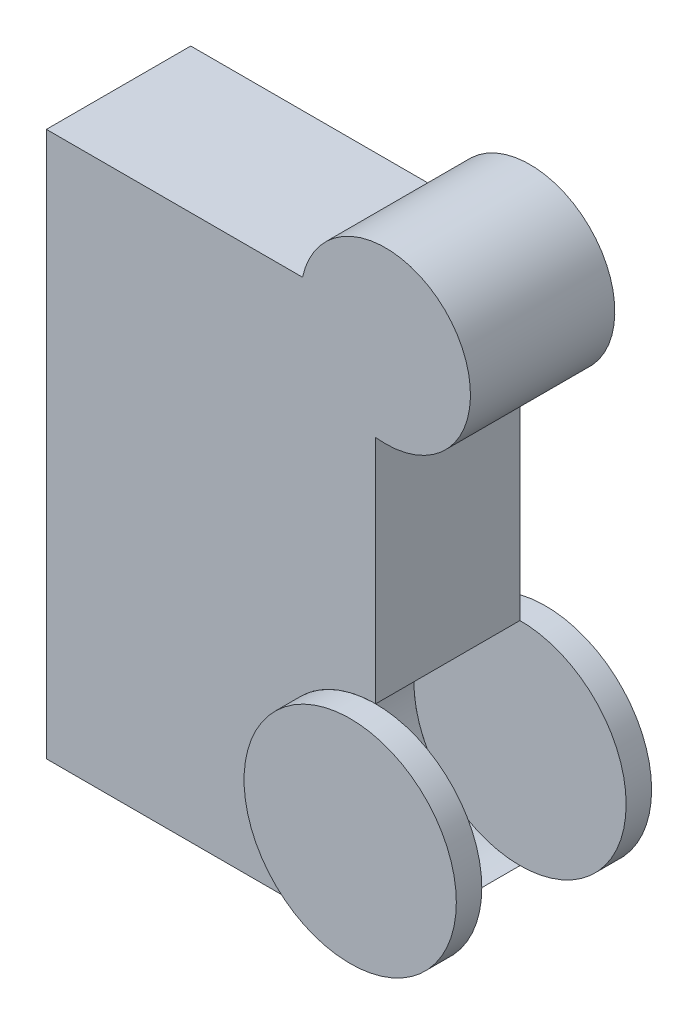
ISO-10303-21;
HEADER;
FILE_DESCRIPTION(('STEP AP214'),'2;1');
FILE_NAME('part.step','',(''),(''),'','','');
FILE_SCHEMA(('AUTOMOTIVE_DESIGN { 1 0 10303 214 1 1 1 1 }'));
ENDSEC;
DATA;
#1=APPLICATION_CONTEXT('core data for automotive mechanical design processes');
#2=APPLICATION_PROTOCOL_DEFINITION('international standard','automotive_design',2000,#1);
#3=PRODUCT_CONTEXT('',#1,'mechanical');
#4=PRODUCT('Part','Part','',(#3));
#5=PRODUCT_RELATED_PRODUCT_CATEGORY('part','',(#4));
#6=PRODUCT_DEFINITION_FORMATION('','',#4);
#7=PRODUCT_DEFINITION_CONTEXT('part definition',#1,'design');
#8=PRODUCT_DEFINITION('design','',#6,#7);
#9=PRODUCT_DEFINITION_SHAPE('','',#8);
#10=(LENGTH_UNIT() NAMED_UNIT(*) SI_UNIT(.MILLI.,.METRE.));
#11=(NAMED_UNIT(*) PLANE_ANGLE_UNIT() SI_UNIT($,.RADIAN.));
#12=(NAMED_UNIT(*) SI_UNIT($,.STERADIAN.) SOLID_ANGLE_UNIT());
#13=UNCERTAINTY_MEASURE_WITH_UNIT(LENGTH_MEASURE(1.E-05),#10,'distance_accuracy_value','');
#14=(GEOMETRIC_REPRESENTATION_CONTEXT(3) GLOBAL_UNCERTAINTY_ASSIGNED_CONTEXT((#13)) GLOBAL_UNIT_ASSIGNED_CONTEXT((#10,
#11,#12)) REPRESENTATION_CONTEXT('',''));
#15=CARTESIAN_POINT('',(0.,0.,0.));
#16=DIRECTION('',(0.,0.,1.));
#17=DIRECTION('',(1.,0.,0.));
#18=AXIS2_PLACEMENT_3D('',#15,#16,#17);
#19=CARTESIAN_POINT('',(18.7796245297524,-18.5926973888303,-11.5));
#20=DIRECTION('',(0.,0.,1.));
#21=DIRECTION('',(-1.,0.,0.));
#22=AXIS2_PLACEMENT_3D('',#19,#20,#21);
#23=CYLINDRICAL_SURFACE('',#22,12.5);
#24=CARTESIAN_POINT('',(18.7796245297524,-18.5926973888303,-11.5));
#25=DIRECTION('',(0.,0.,1.));
#26=DIRECTION('',(1.,0.,0.));
#27=AXIS2_PLACEMENT_3D('',#24,#25,#26);
#28=CIRCLE('',#27,12.5);
#29=CARTESIAN_POINT('',(31.2796245297524,-18.5926973888303,-11.5));
#30=VERTEX_POINT('',#29);
#31=EDGE_CURVE('E11',#30,#30,#28,.T.);
#32=ORIENTED_EDGE('',*,*,#31,.T.);
#33=EDGE_LOOP('',(#32));
#34=FACE_BOUND('',#33,.T.);
#35=CARTESIAN_POINT('',(18.7796245297524,-18.5926973888303,-8.5));
#36=DIRECTION('',(0.,0.,1.));
#37=DIRECTION('',(1.,0.,0.));
#38=AXIS2_PLACEMENT_3D('',#35,#36,#37);
#39=CIRCLE('',#38,12.5);
#40=CARTESIAN_POINT('',(31.2796245297524,-18.5926973888303,-8.5));
#41=VERTEX_POINT('',#40);
#42=EDGE_CURVE('E55',#41,#41,#39,.T.);
#43=ORIENTED_EDGE('',*,*,#42,.F.);
#44=EDGE_LOOP('',(#43));
#45=FACE_BOUND('',#44,.T.);
#46=ADVANCED_FACE('F52',(#34,#45),#23,.T.);
#47=CARTESIAN_POINT('',(18.7796245297524,-18.5926973888303,-11.5));
#48=DIRECTION('',(0.,0.,-1.));
#49=DIRECTION('',(1.,0.,0.));
#50=AXIS2_PLACEMENT_3D('',#47,#48,#49);
#51=PLANE('',#50);
#52=ORIENTED_EDGE('',*,*,#31,.F.);
#53=EDGE_LOOP('',(#52));
#54=FACE_BOUND('',#53,.T.);
#55=ADVANCED_FACE('F67',(#54),#51,.T.);
#56=CARTESIAN_POINT('',(18.7796245297524,-18.5926973888303,-8.5));
#57=DIRECTION('',(0.,0.,-1.));
#58=DIRECTION('',(1.,0.,0.));
#59=AXIS2_PLACEMENT_3D('',#56,#57,#58);
#60=PLANE('',#59);
#61=ORIENTED_EDGE('',*,*,#42,.T.);
#62=EDGE_LOOP('',(#61));
#63=FACE_BOUND('',#62,.T.);
#64=ADVANCED_FACE('F64',(#63),#60,.F.);
#65=CLOSED_SHELL('',(#46,#55,#64));
#66=MANIFOLD_SOLID_BREP('B2',#65);
#67=CARTESIAN_POINT('',(18.7796245297524,-18.5926973888303,11.5));
#68=DIRECTION('',(0.,0.,-1.));
#69=DIRECTION('',(-1.,0.,0.));
#70=AXIS2_PLACEMENT_3D('',#67,#68,#69);
#71=CYLINDRICAL_SURFACE('',#70,12.5);
#72=CARTESIAN_POINT('',(18.7796245297524,-18.5926973888303,11.5));
#73=DIRECTION('',(0.,0.,1.));
#74=DIRECTION('',(1.,0.,0.));
#75=AXIS2_PLACEMENT_3D('',#72,#73,#74);
#76=CIRCLE('',#75,12.5);
#77=CARTESIAN_POINT('',(31.2796245297524,-18.5926973888303,11.5));
#78=VERTEX_POINT('',#77);
#79=EDGE_CURVE('E51',#78,#78,#76,.T.);
#80=ORIENTED_EDGE('',*,*,#79,.F.);
#81=EDGE_LOOP('',(#80));
#82=FACE_BOUND('',#81,.T.);
#83=CARTESIAN_POINT('',(18.7796245297524,-18.5926973888303,8.5));
#84=DIRECTION('',(0.,0.,1.));
#85=DIRECTION('',(1.,0.,0.));
#86=AXIS2_PLACEMENT_3D('',#83,#84,#85);
#87=CIRCLE('',#86,12.5);
#88=CARTESIAN_POINT('',(31.2796245297524,-18.5926973888303,8.5));
#89=VERTEX_POINT('',#88);
#90=EDGE_CURVE('E105',#89,#89,#87,.T.);
#91=ORIENTED_EDGE('',*,*,#90,.T.);
#92=EDGE_LOOP('',(#91));
#93=FACE_BOUND('',#92,.T.);
#94=ADVANCED_FACE('F102',(#82,#93),#71,.T.);
#95=CARTESIAN_POINT('',(18.7796245297524,-18.5926973888303,11.5));
#96=DIRECTION('',(0.,0.,1.));
#97=DIRECTION('',(1.,0.,0.));
#98=AXIS2_PLACEMENT_3D('',#95,#96,#97);
#99=PLANE('',#98);
#100=ORIENTED_EDGE('',*,*,#79,.T.);
#101=EDGE_LOOP('',(#100));
#102=FACE_BOUND('',#101,.T.);
#103=ADVANCED_FACE('F117',(#102),#99,.T.);
#104=CARTESIAN_POINT('',(18.7796245297524,-18.5926973888303,8.5));
#105=DIRECTION('',(0.,0.,1.));
#106=DIRECTION('',(1.,0.,0.));
#107=AXIS2_PLACEMENT_3D('',#104,#105,#106);
#108=PLANE('',#107);
#109=ORIENTED_EDGE('',*,*,#90,.F.);
#110=EDGE_LOOP('',(#109));
#111=FACE_BOUND('',#110,.T.);
#112=ADVANCED_FACE('F115',(#111),#108,.F.);
#113=CLOSED_SHELL('',(#94,#103,#112));
#114=MANIFOLD_SOLID_BREP('B6',#113);
#115=CARTESIAN_POINT('',(18.7796245297524,-18.5926973888303,8.5));
#116=DIRECTION('',(0.,0.,-1.));
#117=DIRECTION('',(-1.,0.,0.));
#118=AXIS2_PLACEMENT_3D('',#115,#116,#117);
#119=CYLINDRICAL_SURFACE('',#118,12.5);
#120=CARTESIAN_POINT('',(18.7796245297524,-18.5926973888303,-8.5));
#121=DIRECTION('',(0.,0.,1.));
#122=DIRECTION('',(1.,0.,0.));
#123=AXIS2_PLACEMENT_3D('',#120,#121,#122);
#124=CIRCLE('',#123,12.5);
#125=CARTESIAN_POINT('',(18.7796245297524,-6.09269738883034,-8.5));
#126=VERTEX_POINT('',#125);
#127=CARTESIAN_POINT('',(18.7796245297524,-31.0926973888303,-8.5));
#128=VERTEX_POINT('',#127);
#129=EDGE_CURVE('E229',#126,#128,#124,.T.);
#130=ORIENTED_EDGE('',*,*,#129,.F.);
#131=DIRECTION('',(0.,0.,-1.));
#132=VECTOR('',#131,1.);
#133=CARTESIAN_POINT('',(18.7796245297524,-6.09269738883034,8.5));
#134=LINE('',#133,#132);
#135=CARTESIAN_POINT('',(18.7796245297524,-6.09269738883034,8.5));
#136=VERTEX_POINT('',#135);
#137=EDGE_CURVE('E100',#136,#126,#134,.T.);
#138=ORIENTED_EDGE('',*,*,#137,.F.);
#139=CARTESIAN_POINT('',(18.7796245297524,-18.5926973888303,8.5));
#140=DIRECTION('',(0.,0.,1.));
#141=DIRECTION('',(1.,0.,0.));
#142=AXIS2_PLACEMENT_3D('',#139,#140,#141);
#143=CIRCLE('',#142,12.5);
#144=CARTESIAN_POINT('',(18.7796245297524,-31.0926973888303,8.5));
#145=VERTEX_POINT('',#144);
#146=EDGE_CURVE('E248',#136,#145,#143,.T.);
#147=ORIENTED_EDGE('',*,*,#146,.T.);
#148=DIRECTION('',(0.,0.,-1.));
#149=VECTOR('',#148,1.);
#150=CARTESIAN_POINT('',(18.7796245297524,-31.0926973888303,8.5));
#151=LINE('',#150,#149);
#152=EDGE_CURVE('E188',#145,#128,#151,.T.);
#153=ORIENTED_EDGE('',*,*,#152,.T.);
#154=EDGE_LOOP('',(#130,#138,#147,#153));
#155=FACE_BOUND('',#154,.T.);
#156=ADVANCED_FACE('F143',(#155),#119,.F.);
#157=CARTESIAN_POINT('',(18.7796245297524,0.,8.5));
#158=DIRECTION('',(-1.,0.,0.));
#159=DIRECTION('',(0.,-1.,0.));
#160=AXIS2_PLACEMENT_3D('',#157,#158,#159);
#161=PLANE('',#160);
#162=DIRECTION('',(0.,1.,0.));
#163=VECTOR('',#162,1.);
#164=CARTESIAN_POINT('',(18.7796245297524,0.,-8.5));
#165=LINE('',#164,#163);
#166=CARTESIAN_POINT('',(18.7796245297524,21.0744541589157,-8.5));
#167=VERTEX_POINT('',#166);
#168=EDGE_CURVE('E233',#126,#167,#165,.T.);
#169=ORIENTED_EDGE('',*,*,#168,.T.);
#170=DIRECTION('',(0.,0.,-1.));
#171=VECTOR('',#170,1.);
#172=CARTESIAN_POINT('',(18.7796245297524,21.0744541589157,8.5));
#173=LINE('',#172,#171);
#174=CARTESIAN_POINT('',(18.7796245297524,21.0744541589157,8.5));
#175=VERTEX_POINT('',#174);
#176=EDGE_CURVE('E152',#175,#167,#173,.T.);
#177=ORIENTED_EDGE('',*,*,#176,.F.);
#178=DIRECTION('',(0.,1.,0.));
#179=VECTOR('',#178,1.);
#180=CARTESIAN_POINT('',(18.7796245297524,0.,8.5));
#181=LINE('',#180,#179);
#182=EDGE_CURVE('E266',#136,#175,#181,.T.);
#183=ORIENTED_EDGE('',*,*,#182,.F.);
#184=ORIENTED_EDGE('',*,*,#137,.T.);
#185=EDGE_LOOP('',(#169,#177,#183,#184));
#186=FACE_BOUND('',#185,.T.);
#187=ADVANCED_FACE('F271',(#186),#161,.F.);
#188=CARTESIAN_POINT('',(19.9444763914068,31.0063784508342,8.5));
#189=DIRECTION('',(0.,0.,-1.));
#190=DIRECTION('',(-1.,0.,0.));
#191=AXIS2_PLACEMENT_3D('',#188,#189,#190);
#192=CYLINDRICAL_SURFACE('',#191,10.);
#193=CARTESIAN_POINT('',(19.9444763914068,31.0063784508342,-8.5));
#194=DIRECTION('',(0.,0.,1.));
#195=DIRECTION('',(1.,0.,0.));
#196=AXIS2_PLACEMENT_3D('',#193,#194,#195);
#197=CIRCLE('',#196,10.);
#198=CARTESIAN_POINT('',(10.168935783151,33.1132258151066,-8.5));
#199=VERTEX_POINT('',#198);
#200=EDGE_CURVE('E236',#167,#199,#197,.T.);
#201=ORIENTED_EDGE('',*,*,#200,.T.);
#202=DIRECTION('',(0.,0.,-1.));
#203=VECTOR('',#202,1.);
#204=CARTESIAN_POINT('',(10.168935783151,33.1132258151066,8.5));
#205=LINE('',#204,#203);
#206=CARTESIAN_POINT('',(10.168935783151,33.1132258151066,8.5));
#207=VERTEX_POINT('',#206);
#208=EDGE_CURVE('E213',#207,#199,#205,.T.);
#209=ORIENTED_EDGE('',*,*,#208,.F.);
#210=CARTESIAN_POINT('',(19.9444763914068,31.0063784508342,8.5));
#211=DIRECTION('',(0.,0.,1.));
#212=DIRECTION('',(1.,0.,0.));
#213=AXIS2_PLACEMENT_3D('',#210,#211,#212);
#214=CIRCLE('',#213,10.);
#215=EDGE_CURVE('E218',#175,#207,#214,.T.);
#216=ORIENTED_EDGE('',*,*,#215,.F.);
#217=ORIENTED_EDGE('',*,*,#176,.T.);
#218=EDGE_LOOP('',(#201,#209,#216,#217));
#219=FACE_BOUND('',#218,.T.);
#220=ADVANCED_FACE('F259',(#219),#192,.T.);
#221=CARTESIAN_POINT('',(0.,33.1132258151066,8.5));
#222=DIRECTION('',(0.,1.,0.));
#223=DIRECTION('',(0.,0.,1.));
#224=AXIS2_PLACEMENT_3D('',#221,#222,#223);
#225=PLANE('',#224);
#226=DIRECTION('',(1.,0.,0.));
#227=VECTOR('',#226,1.);
#228=CARTESIAN_POINT('',(0.,33.1132258151066,-8.5));
#229=LINE('',#228,#227);
#230=CARTESIAN_POINT('',(-20.,33.1132258151066,-8.5));
#231=VERTEX_POINT('',#230);
#232=EDGE_CURVE('E207',#231,#199,#229,.T.);
#233=ORIENTED_EDGE('',*,*,#232,.F.);
#234=DIRECTION('',(0.,0.,-1.));
#235=VECTOR('',#234,1.);
#236=CARTESIAN_POINT('',(-20.,33.1132258151066,8.5));
#237=LINE('',#236,#235);
#238=CARTESIAN_POINT('',(-20.,33.1132258151066,8.5));
#239=VERTEX_POINT('',#238);
#240=EDGE_CURVE('E202',#239,#231,#237,.T.);
#241=ORIENTED_EDGE('',*,*,#240,.F.);
#242=DIRECTION('',(1.,0.,0.));
#243=VECTOR('',#242,1.);
#244=CARTESIAN_POINT('',(0.,33.1132258151066,8.5));
#245=LINE('',#244,#243);
#246=EDGE_CURVE('E205',#239,#207,#245,.T.);
#247=ORIENTED_EDGE('',*,*,#246,.T.);
#248=ORIENTED_EDGE('',*,*,#208,.T.);
#249=EDGE_LOOP('',(#233,#241,#247,#248));
#250=FACE_BOUND('',#249,.T.);
#251=ADVANCED_FACE('F204',(#250),#225,.T.);
#252=CARTESIAN_POINT('',(-20.,0.,8.5));
#253=DIRECTION('',(-1.,0.,0.));
#254=DIRECTION('',(0.,-1.,0.));
#255=AXIS2_PLACEMENT_3D('',#252,#253,#254);
#256=PLANE('',#255);
#257=DIRECTION('',(0.,1.,0.));
#258=VECTOR('',#257,1.);
#259=CARTESIAN_POINT('',(-20.,0.,-8.5));
#260=LINE('',#259,#258);
#261=CARTESIAN_POINT('',(-20.,-31.0926973888303,-8.5));
#262=VERTEX_POINT('',#261);
#263=EDGE_CURVE('E242',#262,#231,#260,.T.);
#264=ORIENTED_EDGE('',*,*,#263,.F.);
#265=DIRECTION('',(0.,0.,-1.));
#266=VECTOR('',#265,1.);
#267=CARTESIAN_POINT('',(-20.,-31.0926973888303,8.5));
#268=LINE('',#267,#266);
#269=CARTESIAN_POINT('',(-20.,-31.0926973888303,8.5));
#270=VERTEX_POINT('',#269);
#271=EDGE_CURVE('E181',#270,#262,#268,.T.);
#272=ORIENTED_EDGE('',*,*,#271,.F.);
#273=DIRECTION('',(0.,1.,0.));
#274=VECTOR('',#273,1.);
#275=CARTESIAN_POINT('',(-20.,0.,8.5));
#276=LINE('',#275,#274);
#277=EDGE_CURVE('E216',#270,#239,#276,.T.);
#278=ORIENTED_EDGE('',*,*,#277,.T.);
#279=ORIENTED_EDGE('',*,*,#240,.T.);
#280=EDGE_LOOP('',(#264,#272,#278,#279));
#281=FACE_BOUND('',#280,.T.);
#282=ADVANCED_FACE('F222',(#281),#256,.T.);
#283=CARTESIAN_POINT('',(0.,-31.0926973888303,8.5));
#284=DIRECTION('',(0.,1.,0.));
#285=DIRECTION('',(0.,0.,1.));
#286=AXIS2_PLACEMENT_3D('',#283,#284,#285);
#287=PLANE('',#286);
#288=DIRECTION('',(1.,0.,0.));
#289=VECTOR('',#288,1.);
#290=CARTESIAN_POINT('',(0.,-31.0926973888303,-8.5));
#291=LINE('',#290,#289);
#292=EDGE_CURVE('E245',#262,#128,#291,.T.);
#293=ORIENTED_EDGE('',*,*,#292,.T.);
#294=ORIENTED_EDGE('',*,*,#152,.F.);
#295=DIRECTION('',(1.,0.,0.));
#296=VECTOR('',#295,1.);
#297=CARTESIAN_POINT('',(0.,-31.0926973888303,8.5));
#298=LINE('',#297,#296);
#299=EDGE_CURVE('E160',#270,#145,#298,.T.);
#300=ORIENTED_EDGE('',*,*,#299,.F.);
#301=ORIENTED_EDGE('',*,*,#271,.T.);
#302=EDGE_LOOP('',(#293,#294,#300,#301));
#303=FACE_BOUND('',#302,.T.);
#304=ADVANCED_FACE('F264',(#303),#287,.F.);
#305=CARTESIAN_POINT('',(0.,0.,8.5));
#306=DIRECTION('',(0.,0.,1.));
#307=DIRECTION('',(1.,0.,0.));
#308=AXIS2_PLACEMENT_3D('',#305,#306,#307);
#309=PLANE('',#308);
#310=ORIENTED_EDGE('',*,*,#146,.F.);
#311=ORIENTED_EDGE('',*,*,#182,.T.);
#312=ORIENTED_EDGE('',*,*,#215,.T.);
#313=ORIENTED_EDGE('',*,*,#246,.F.);
#314=ORIENTED_EDGE('',*,*,#277,.F.);
#315=ORIENTED_EDGE('',*,*,#299,.T.);
#316=EDGE_LOOP('',(#310,#311,#312,#313,#314,#315));
#317=FACE_BOUND('',#316,.T.);
#318=ADVANCED_FACE('F215',(#317),#309,.T.);
#319=CARTESIAN_POINT('',(0.,0.,-8.5));
#320=DIRECTION('',(0.,0.,1.));
#321=DIRECTION('',(1.,0.,0.));
#322=AXIS2_PLACEMENT_3D('',#319,#320,#321);
#323=PLANE('',#322);
#324=ORIENTED_EDGE('',*,*,#129,.T.);
#325=ORIENTED_EDGE('',*,*,#292,.F.);
#326=ORIENTED_EDGE('',*,*,#263,.T.);
#327=ORIENTED_EDGE('',*,*,#232,.T.);
#328=ORIENTED_EDGE('',*,*,#200,.F.);
#329=ORIENTED_EDGE('',*,*,#168,.F.);
#330=EDGE_LOOP('',(#324,#325,#326,#327,#328,#329));
#331=FACE_BOUND('',#330,.T.);
#332=ADVANCED_FACE('F263',(#331),#323,.F.);
#333=CLOSED_SHELL('',(#156,#187,#220,#251,#282,#304,#318,#332));
#334=MANIFOLD_SOLID_BREP('B46',#333);
#335=ADVANCED_BREP_SHAPE_REPRESENTATION('',(#18,#66,#114,#334),#14);
#336=SHAPE_DEFINITION_REPRESENTATION(#9,#335);
ENDSEC;
END-ISO-10303-21;
